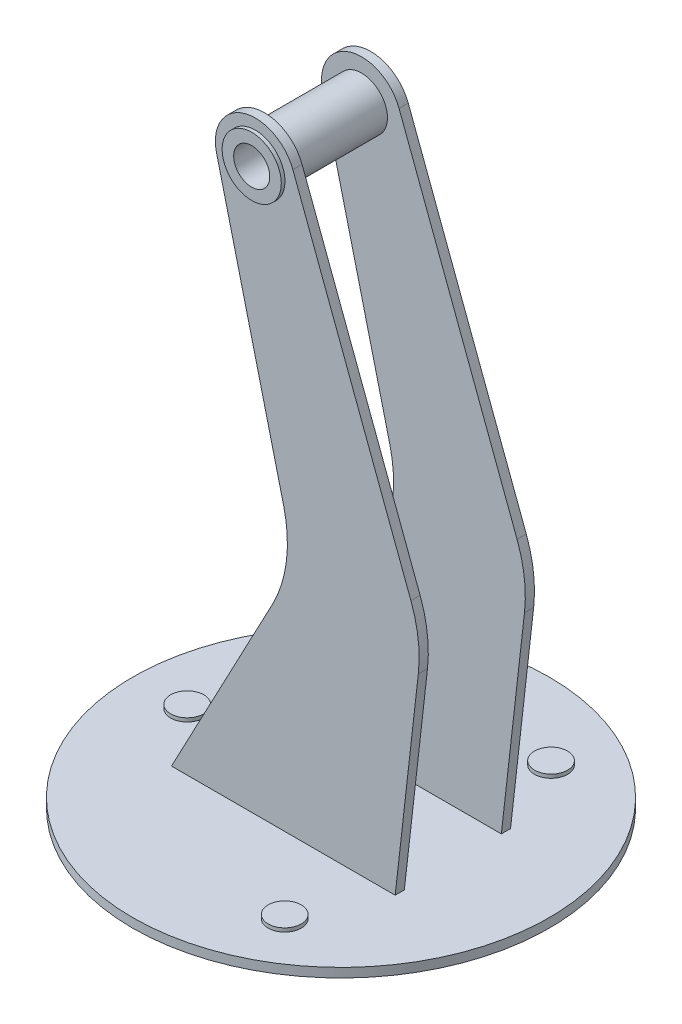
ISO-10303-21;
HEADER;
FILE_DESCRIPTION(('STEP AP214'),'2;1');
FILE_NAME('part.step','',(''),(''),'','','');
FILE_SCHEMA(('AUTOMOTIVE_DESIGN { 1 0 10303 214 1 1 1 1 }'));
ENDSEC;
DATA;
#1=APPLICATION_CONTEXT('core data for automotive mechanical design processes');
#2=APPLICATION_PROTOCOL_DEFINITION('international standard','automotive_design',2000,#1);
#3=PRODUCT_CONTEXT('',#1,'mechanical');
#4=PRODUCT('Part','Part','',(#3));
#5=PRODUCT_RELATED_PRODUCT_CATEGORY('part','',(#4));
#6=PRODUCT_DEFINITION_FORMATION('','',#4);
#7=PRODUCT_DEFINITION_CONTEXT('part definition',#1,'design');
#8=PRODUCT_DEFINITION('design','',#6,#7);
#9=PRODUCT_DEFINITION_SHAPE('','',#8);
#10=(LENGTH_UNIT() NAMED_UNIT(*) SI_UNIT(.MILLI.,.METRE.));
#11=(NAMED_UNIT(*) PLANE_ANGLE_UNIT() SI_UNIT($,.RADIAN.));
#12=(NAMED_UNIT(*) SI_UNIT($,.STERADIAN.) SOLID_ANGLE_UNIT());
#13=UNCERTAINTY_MEASURE_WITH_UNIT(LENGTH_MEASURE(1.E-05),#10,'distance_accuracy_value','');
#14=(GEOMETRIC_REPRESENTATION_CONTEXT(3) GLOBAL_UNCERTAINTY_ASSIGNED_CONTEXT((#13)) GLOBAL_UNIT_ASSIGNED_CONTEXT((#10,
#11,#12)) REPRESENTATION_CONTEXT('',''));
#15=CARTESIAN_POINT('',(0.,0.,0.));
#16=DIRECTION('',(0.,0.,1.));
#17=DIRECTION('',(1.,0.,0.));
#18=AXIS2_PLACEMENT_3D('',#15,#16,#17);
#19=CARTESIAN_POINT('',(59.2200227638363,101.639822494205,0.));
#20=DIRECTION('',(0.,0.,1.));
#21=DIRECTION('',(1.,0.,0.));
#22=AXIS2_PLACEMENT_3D('',#19,#20,#21);
#23=PLANE('',#22);
#24=DIRECTION('',(-0.351683066962373,0.936119127254613,0.));
#25=VECTOR('',#24,1.);
#26=CARTESIAN_POINT('',(149.768395279453,-77.4534922948731,0.));
#27=LINE('',#26,#25);
#28=CARTESIAN_POINT('',(143.838193737558,-61.6683277153218,0.));
#29=VERTEX_POINT('',#28);
#30=CARTESIAN_POINT('',(79.6086760457793,109.299471686989,0.));
#31=VERTEX_POINT('',#30);
#32=EDGE_CURVE('E207',#29,#31,#27,.T.);
#33=ORIENTED_EDGE('',*,*,#32,.F.);
#34=CARTESIAN_POINT('',(78.309854829735,-86.2861424026879,0.));
#35=DIRECTION('',(0.,0.,1.));
#36=DIRECTION('',(1.,0.,0.));
#37=AXIS2_PLACEMENT_3D('',#34,#35,#36);
#38=CIRCLE('',#37,70.);
#39=CARTESIAN_POINT('',(147.860208774999,-94.207522717289,0.));
#40=VERTEX_POINT('',#39);
#41=EDGE_CURVE('E254',#29,#40,#38,.F.);
#42=ORIENTED_EDGE('',*,*,#41,.T.);
#43=DIRECTION('',(0.113162575922872,0.993576484932338,0.));
#44=VECTOR('',#43,1.);
#45=CARTESIAN_POINT('',(135.270890904909,-204.742742466833,0.));
#46=LINE('',#45,#44);
#47=CARTESIAN_POINT('',(135.270890904909,-204.742742466833,0.));
#48=VERTEX_POINT('',#47);
#49=EDGE_CURVE('E204',#48,#40,#46,.T.);
#50=ORIENTED_EDGE('',*,*,#49,.F.);
#51=DIRECTION('',(1.,0.,0.));
#52=VECTOR('',#51,1.);
#53=CARTESIAN_POINT('',(13.5588334424044,-204.742742466833,0.));
#54=LINE('',#53,#52);
#55=CARTESIAN_POINT('',(13.5588334424044,-204.742742466833,0.));
#56=VERTEX_POINT('',#55);
#57=EDGE_CURVE('E184',#56,#48,#54,.T.);
#58=ORIENTED_EDGE('',*,*,#57,.F.);
#59=DIRECTION('',(-0.46817366437276,-0.883636475021138,0.));
#60=VECTOR('',#59,1.);
#61=CARTESIAN_POINT('',(13.5588334424044,-204.742742466833,0.));
#62=LINE('',#61,#60);
#63=CARTESIAN_POINT('',(68.4921371443526,-101.060979611828,0.));
#64=VERTEX_POINT('',#63);
#65=EDGE_CURVE('E189',#64,#56,#62,.T.);
#66=ORIENTED_EDGE('',*,*,#65,.F.);
#67=CARTESIAN_POINT('',(6.63758389287289,-68.2888231057347,0.));
#68=DIRECTION('',(0.,0.,1.));
#69=DIRECTION('',(1.,0.,0.));
#70=AXIS2_PLACEMENT_3D('',#67,#68,#69);
#71=CIRCLE('',#70,70.);
#72=CARTESIAN_POINT('',(74.5982821099149,-51.5155259387451,0.));
#73=VERTEX_POINT('',#72);
#74=EDGE_CURVE('E247',#64,#73,#71,.T.);
#75=ORIENTED_EDGE('',*,*,#74,.T.);
#76=DIRECTION('',(0.239618530956994,-0.970867117386315,0.));
#77=VECTOR('',#76,1.);
#78=CARTESIAN_POINT('',(81.,-77.4534922948731,0.));
#79=LINE('',#78,#77);
#80=CARTESIAN_POINT('',(38.2541588282178,95.7406735860193,0.));
#81=VERTEX_POINT('',#80);
#82=EDGE_CURVE('E211',#81,#73,#79,.T.);
#83=ORIENTED_EDGE('',*,*,#82,.F.);
#84=CARTESIAN_POINT('',(59.2200227638363,101.639822494205,0.));
#85=DIRECTION('',(0.,0.,1.));
#86=DIRECTION('',(1.,0.,0.));
#87=AXIS2_PLACEMENT_3D('',#84,#85,#86);
#88=CIRCLE('',#87,21.7799772361638);
#89=EDGE_CURVE('E209',#31,#81,#88,.T.);
#90=ORIENTED_EDGE('',*,*,#89,.F.);
#91=EDGE_LOOP('',(#33,#42,#50,#58,#66,#75,#83,#90));
#92=FACE_BOUND('',#91,.T.);
#93=CARTESIAN_POINT('',(59.2200227638363,101.639822494205,0.));
#94=DIRECTION('',(0.,0.,1.));
#95=DIRECTION('',(1.,0.,0.));
#96=AXIS2_PLACEMENT_3D('',#93,#94,#95);
#97=CIRCLE('',#96,16.0901380161359);
#98=CARTESIAN_POINT('',(75.3101607799722,101.639822494205,0.));
#99=VERTEX_POINT('',#98);
#100=EDGE_CURVE('E230',#99,#99,#97,.F.);
#101=ORIENTED_EDGE('',*,*,#100,.F.);
#102=EDGE_LOOP('',(#101));
#103=FACE_BOUND('',#102,.T.);
#104=ADVANCED_FACE('F32',(#92,#103),#23,.F.);
#105=CARTESIAN_POINT('',(59.2200227638363,101.639822494205,62.766798880928));
#106=DIRECTION('',(0.,0.,-1.));
#107=DIRECTION('',(0.,1.,0.));
#108=AXIS2_PLACEMENT_3D('',#105,#106,#107);
#109=PLANE('',#108);
#110=DIRECTION('',(-0.113162575922872,-0.993576484932338,0.));
#111=VECTOR('',#110,1.);
#112=CARTESIAN_POINT('',(149.768395279453,-77.4534922948731,62.7667988809279));
#113=LINE('',#112,#111);
#114=CARTESIAN_POINT('',(147.860208774999,-94.2075227172889,62.7667988809279));
#115=VERTEX_POINT('',#114);
#116=CARTESIAN_POINT('',(135.270890904909,-204.742742466833,62.7667988809279));
#117=VERTEX_POINT('',#116);
#118=EDGE_CURVE('E171',#115,#117,#113,.T.);
#119=ORIENTED_EDGE('',*,*,#118,.F.);
#120=CARTESIAN_POINT('',(78.309854829735,-86.2861424026879,62.7667988809279));
#121=DIRECTION('',(0.,0.,-1.));
#122=DIRECTION('',(0.,1.,0.));
#123=AXIS2_PLACEMENT_3D('',#120,#121,#122);
#124=CIRCLE('',#123,70.);
#125=CARTESIAN_POINT('',(143.838193737558,-61.6683277153217,62.7667988809279));
#126=VERTEX_POINT('',#125);
#127=EDGE_CURVE('E55',#115,#126,#124,.F.);
#128=ORIENTED_EDGE('',*,*,#127,.T.);
#129=DIRECTION('',(0.351683066962373,-0.936119127254613,0.));
#130=VECTOR('',#129,1.);
#131=CARTESIAN_POINT('',(79.6086760457792,109.299471686989,62.766798880928));
#132=LINE('',#131,#130);
#133=CARTESIAN_POINT('',(79.6086760457793,109.299471686989,62.766798880928));
#134=VERTEX_POINT('',#133);
#135=EDGE_CURVE('E168',#134,#126,#132,.T.);
#136=ORIENTED_EDGE('',*,*,#135,.F.);
#137=CARTESIAN_POINT('',(59.2200227638363,101.639822494205,62.766798880928));
#138=DIRECTION('',(0.,0.,-1.));
#139=DIRECTION('',(0.,1.,0.));
#140=AXIS2_PLACEMENT_3D('',#137,#138,#139);
#141=CIRCLE('',#140,21.7799772361638);
#142=CARTESIAN_POINT('',(38.2541588282178,95.7406735860193,62.766798880928));
#143=VERTEX_POINT('',#142);
#144=EDGE_CURVE('E320',#143,#134,#141,.T.);
#145=ORIENTED_EDGE('',*,*,#144,.F.);
#146=DIRECTION('',(-0.239618530956994,0.970867117386315,0.));
#147=VECTOR('',#146,1.);
#148=CARTESIAN_POINT('',(81.,-77.4534922948731,62.7667988809279));
#149=LINE('',#148,#147);
#150=CARTESIAN_POINT('',(74.5982821099149,-51.5155259387451,62.7667988809279));
#151=VERTEX_POINT('',#150);
#152=EDGE_CURVE('E318',#151,#143,#149,.T.);
#153=ORIENTED_EDGE('',*,*,#152,.F.);
#154=CARTESIAN_POINT('',(6.63758389287289,-68.2888231057347,62.7667988809279));
#155=DIRECTION('',(0.,0.,-1.));
#156=DIRECTION('',(0.,1.,0.));
#157=AXIS2_PLACEMENT_3D('',#154,#155,#156);
#158=CIRCLE('',#157,70.);
#159=CARTESIAN_POINT('',(68.4921371443526,-101.060979611828,62.7667988809279));
#160=VERTEX_POINT('',#159);
#161=EDGE_CURVE('E243',#151,#160,#158,.T.);
#162=ORIENTED_EDGE('',*,*,#161,.T.);
#163=DIRECTION('',(0.46817366437276,0.883636475021138,0.));
#164=VECTOR('',#163,1.);
#165=CARTESIAN_POINT('',(13.5588334424044,-204.742742466833,62.7667988809279));
#166=LINE('',#165,#164);
#167=CARTESIAN_POINT('',(13.5588334424044,-204.742742466833,62.7667988809279));
#168=VERTEX_POINT('',#167);
#169=EDGE_CURVE('E315',#168,#160,#166,.T.);
#170=ORIENTED_EDGE('',*,*,#169,.F.);
#171=DIRECTION('',(-1.,0.,0.));
#172=VECTOR('',#171,1.);
#173=CARTESIAN_POINT('',(135.270890904909,-204.742742466833,62.7667988809279));
#174=LINE('',#173,#172);
#175=EDGE_CURVE('E313',#117,#168,#174,.T.);
#176=ORIENTED_EDGE('',*,*,#175,.F.);
#177=EDGE_LOOP('',(#119,#128,#136,#145,#153,#162,#170,#176));
#178=FACE_BOUND('',#177,.T.);
#179=CARTESIAN_POINT('',(59.2200227638363,101.639822494205,62.766798880928));
#180=DIRECTION('',(0.,0.,-1.));
#181=DIRECTION('',(0.,1.,0.));
#182=AXIS2_PLACEMENT_3D('',#179,#180,#181);
#183=CIRCLE('',#182,16.0901380161359);
#184=CARTESIAN_POINT('',(59.2200227638363,117.729960510341,62.766798880928));
#185=VERTEX_POINT('',#184);
#186=EDGE_CURVE('E227',#185,#185,#183,.F.);
#187=ORIENTED_EDGE('',*,*,#186,.F.);
#188=EDGE_LOOP('',(#187));
#189=FACE_BOUND('',#188,.T.);
#190=ADVANCED_FACE('F334',(#178,#189),#109,.F.);
#191=CARTESIAN_POINT('',(59.2200227638363,101.639822494205,5.));
#192=DIRECTION('',(0.,0.,1.));
#193=DIRECTION('',(1.,0.,0.));
#194=AXIS2_PLACEMENT_3D('',#191,#192,#193);
#195=PLANE('',#194);
#196=DIRECTION('',(0.113162575922872,0.993576484932338,0.));
#197=VECTOR('',#196,1.);
#198=CARTESIAN_POINT('',(135.270890904909,-204.742742466833,5.));
#199=LINE('',#198,#197);
#200=CARTESIAN_POINT('',(135.270890904909,-204.742742466833,5.));
#201=VERTEX_POINT('',#200);
#202=CARTESIAN_POINT('',(147.860208774999,-94.207522717289,5.));
#203=VERTEX_POINT('',#202);
#204=EDGE_CURVE('E188',#201,#203,#199,.T.);
#205=ORIENTED_EDGE('',*,*,#204,.T.);
#206=CARTESIAN_POINT('',(78.309854829735,-86.2861424026879,5.));
#207=DIRECTION('',(0.,0.,1.));
#208=DIRECTION('',(1.,0.,0.));
#209=AXIS2_PLACEMENT_3D('',#206,#207,#208);
#210=CIRCLE('',#209,70.);
#211=CARTESIAN_POINT('',(143.838193737558,-61.6683277153218,5.));
#212=VERTEX_POINT('',#211);
#213=EDGE_CURVE('E258',#203,#212,#210,.T.);
#214=ORIENTED_EDGE('',*,*,#213,.T.);
#215=DIRECTION('',(-0.351683066962373,0.936119127254613,0.));
#216=VECTOR('',#215,1.);
#217=CARTESIAN_POINT('',(149.768395279453,-77.4534922948731,5.));
#218=LINE('',#217,#216);
#219=CARTESIAN_POINT('',(79.6086760457793,109.299471686989,5.));
#220=VERTEX_POINT('',#219);
#221=EDGE_CURVE('E192',#212,#220,#218,.T.);
#222=ORIENTED_EDGE('',*,*,#221,.T.);
#223=CARTESIAN_POINT('',(59.2200227638363,101.639822494205,5.));
#224=DIRECTION('',(0.,0.,1.));
#225=DIRECTION('',(1.,0.,0.));
#226=AXIS2_PLACEMENT_3D('',#223,#224,#225);
#227=CIRCLE('',#226,21.7799772361638);
#228=CARTESIAN_POINT('',(38.2541588282178,95.7406735860193,5.));
#229=VERTEX_POINT('',#228);
#230=EDGE_CURVE('E194',#220,#229,#227,.T.);
#231=ORIENTED_EDGE('',*,*,#230,.T.);
#232=DIRECTION('',(0.239618530956994,-0.970867117386315,0.));
#233=VECTOR('',#232,1.);
#234=CARTESIAN_POINT('',(81.,-77.4534922948731,5.));
#235=LINE('',#234,#233);
#236=CARTESIAN_POINT('',(74.5982821099149,-51.5155259387451,5.));
#237=VERTEX_POINT('',#236);
#238=EDGE_CURVE('E196',#229,#237,#235,.T.);
#239=ORIENTED_EDGE('',*,*,#238,.T.);
#240=CARTESIAN_POINT('',(6.63758389287289,-68.2888231057347,5.));
#241=DIRECTION('',(0.,0.,1.));
#242=DIRECTION('',(1.,0.,0.));
#243=AXIS2_PLACEMENT_3D('',#240,#241,#242);
#244=CIRCLE('',#243,70.);
#245=CARTESIAN_POINT('',(68.4921371443526,-101.060979611828,5.));
#246=VERTEX_POINT('',#245);
#247=EDGE_CURVE('E249',#237,#246,#244,.F.);
#248=ORIENTED_EDGE('',*,*,#247,.T.);
#249=DIRECTION('',(-0.46817366437276,-0.883636475021138,0.));
#250=VECTOR('',#249,1.);
#251=CARTESIAN_POINT('',(13.5588334424044,-204.742742466833,5.));
#252=LINE('',#251,#250);
#253=CARTESIAN_POINT('',(13.5588334424044,-204.742742466833,5.));
#254=VERTEX_POINT('',#253);
#255=EDGE_CURVE('E199',#246,#254,#252,.T.);
#256=ORIENTED_EDGE('',*,*,#255,.T.);
#257=DIRECTION('',(1.,0.,0.));
#258=VECTOR('',#257,1.);
#259=CARTESIAN_POINT('',(13.5588334424044,-204.742742466833,5.));
#260=LINE('',#259,#258);
#261=EDGE_CURVE('E185',#254,#201,#260,.T.);
#262=ORIENTED_EDGE('',*,*,#261,.T.);
#263=EDGE_LOOP('',(#205,#214,#222,#231,#239,#248,#256,#262));
#264=FACE_BOUND('',#263,.T.);
#265=CARTESIAN_POINT('',(59.2200227638363,101.639822494205,5.));
#266=DIRECTION('',(0.,0.,1.));
#267=DIRECTION('',(1.,0.,0.));
#268=AXIS2_PLACEMENT_3D('',#265,#266,#267);
#269=CIRCLE('',#268,14.0768017661452);
#270=CARTESIAN_POINT('',(73.2968245299815,101.639822494205,5.));
#271=VERTEX_POINT('',#270);
#272=EDGE_CURVE('E176',#271,#271,#269,.T.);
#273=ORIENTED_EDGE('',*,*,#272,.F.);
#274=EDGE_LOOP('',(#273));
#275=FACE_BOUND('',#274,.T.);
#276=ADVANCED_FACE('F361',(#264,#275),#195,.T.);
#277=CARTESIAN_POINT('',(135.270890904909,-204.742742466833,5.));
#278=DIRECTION('',(-0.993576484932338,0.113162575922872,0.));
#279=DIRECTION('',(-0.113162575922872,-0.993576484932338,0.));
#280=AXIS2_PLACEMENT_3D('',#277,#278,#279);
#281=PLANE('',#280);
#282=ORIENTED_EDGE('',*,*,#49,.T.);
#283=DIRECTION('',(0.,0.,-1.));
#284=VECTOR('',#283,1.);
#285=CARTESIAN_POINT('',(147.860208774999,-94.207522717289,5.));
#286=LINE('',#285,#284);
#287=EDGE_CURVE('E256',#40,#203,#286,.F.);
#288=ORIENTED_EDGE('',*,*,#287,.T.);
#289=ORIENTED_EDGE('',*,*,#204,.F.);
#290=DIRECTION('',(0.,0.,-1.));
#291=VECTOR('',#290,1.);
#292=CARTESIAN_POINT('',(135.270890904909,-204.742742466833,5.));
#293=LINE('',#292,#291);
#294=EDGE_CURVE('E224',#201,#48,#293,.T.);
#295=ORIENTED_EDGE('',*,*,#294,.T.);
#296=EDGE_LOOP('',(#282,#288,#289,#295));
#297=FACE_BOUND('',#296,.T.);
#298=ADVANCED_FACE('F384',(#297),#281,.F.);
#299=CARTESIAN_POINT('',(149.768395279453,-77.4534922948731,5.));
#300=DIRECTION('',(-0.936119127254613,-0.351683066962373,0.));
#301=DIRECTION('',(0.351683066962373,-0.936119127254613,0.));
#302=AXIS2_PLACEMENT_3D('',#299,#300,#301);
#303=PLANE('',#302);
#304=ORIENTED_EDGE('',*,*,#221,.F.);
#305=DIRECTION('',(0.,0.,-1.));
#306=VECTOR('',#305,1.);
#307=CARTESIAN_POINT('',(143.838193737558,-61.6683277153218,5.));
#308=LINE('',#307,#306);
#309=EDGE_CURVE('E251',#212,#29,#308,.T.);
#310=ORIENTED_EDGE('',*,*,#309,.T.);
#311=ORIENTED_EDGE('',*,*,#32,.T.);
#312=DIRECTION('',(0.,0.,-1.));
#313=VECTOR('',#312,1.);
#314=CARTESIAN_POINT('',(79.6086760457793,109.299471686989,5.));
#315=LINE('',#314,#313);
#316=EDGE_CURVE('E221',#220,#31,#315,.T.);
#317=ORIENTED_EDGE('',*,*,#316,.F.);
#318=EDGE_LOOP('',(#304,#310,#311,#317));
#319=FACE_BOUND('',#318,.T.);
#320=ADVANCED_FACE('F380',(#319),#303,.F.);
#321=CARTESIAN_POINT('',(59.2200227638363,101.639822494205,5.));
#322=DIRECTION('',(0.,0.,-1.));
#323=DIRECTION('',(-1.,0.,0.));
#324=AXIS2_PLACEMENT_3D('',#321,#322,#323);
#325=CYLINDRICAL_SURFACE('',#324,21.7799772361638);
#326=ORIENTED_EDGE('',*,*,#89,.T.);
#327=DIRECTION('',(0.,0.,-1.));
#328=VECTOR('',#327,1.);
#329=CARTESIAN_POINT('',(38.2541588282178,95.7406735860193,5.));
#330=LINE('',#329,#328);
#331=EDGE_CURVE('E218',#229,#81,#330,.T.);
#332=ORIENTED_EDGE('',*,*,#331,.F.);
#333=ORIENTED_EDGE('',*,*,#230,.F.);
#334=ORIENTED_EDGE('',*,*,#316,.T.);
#335=EDGE_LOOP('',(#326,#332,#333,#334));
#336=FACE_BOUND('',#335,.T.);
#337=ADVANCED_FACE('F376',(#336),#325,.T.);
#338=CARTESIAN_POINT('',(81.,-77.4534922948731,5.));
#339=DIRECTION('',(0.970867117386315,0.239618530956994,0.));
#340=DIRECTION('',(-0.239618530956994,0.970867117386315,0.));
#341=AXIS2_PLACEMENT_3D('',#338,#339,#340);
#342=PLANE('',#341);
#343=ORIENTED_EDGE('',*,*,#82,.T.);
#344=DIRECTION('',(0.,0.,-1.));
#345=VECTOR('',#344,1.);
#346=CARTESIAN_POINT('',(74.5982821099149,-51.5155259387451,5.));
#347=LINE('',#346,#345);
#348=EDGE_CURVE('E241',#73,#237,#347,.F.);
#349=ORIENTED_EDGE('',*,*,#348,.T.);
#350=ORIENTED_EDGE('',*,*,#238,.F.);
#351=ORIENTED_EDGE('',*,*,#331,.T.);
#352=EDGE_LOOP('',(#343,#349,#350,#351));
#353=FACE_BOUND('',#352,.T.);
#354=ADVANCED_FACE('F372',(#353),#342,.F.);
#355=CARTESIAN_POINT('',(13.5588334424044,-204.742742466833,5.));
#356=DIRECTION('',(0.883636475021138,-0.46817366437276,0.));
#357=DIRECTION('',(0.46817366437276,0.883636475021138,0.));
#358=AXIS2_PLACEMENT_3D('',#355,#356,#357);
#359=PLANE('',#358);
#360=ORIENTED_EDGE('',*,*,#255,.F.);
#361=DIRECTION('',(0.,0.,-1.));
#362=VECTOR('',#361,1.);
#363=CARTESIAN_POINT('',(68.4921371443526,-101.060979611828,0.));
#364=LINE('',#363,#362);
#365=EDGE_CURVE('E238',#246,#64,#364,.T.);
#366=ORIENTED_EDGE('',*,*,#365,.T.);
#367=ORIENTED_EDGE('',*,*,#65,.T.);
#368=DIRECTION('',(0.,0.,-1.));
#369=VECTOR('',#368,1.);
#370=CARTESIAN_POINT('',(13.5588334424044,-204.742742466833,5.));
#371=LINE('',#370,#369);
#372=EDGE_CURVE('E201',#254,#56,#371,.T.);
#373=ORIENTED_EDGE('',*,*,#372,.F.);
#374=EDGE_LOOP('',(#360,#366,#367,#373));
#375=FACE_BOUND('',#374,.T.);
#376=ADVANCED_FACE('F368',(#375),#359,.F.);
#377=CARTESIAN_POINT('',(59.2200227638363,101.639822494205,5.));
#378=DIRECTION('',(0.,0.,-1.));
#379=DIRECTION('',(-1.,0.,0.));
#380=AXIS2_PLACEMENT_3D('',#377,#378,#379);
#381=CYLINDRICAL_SURFACE('',#380,9.81013134883745);
#382=CARTESIAN_POINT('',(59.2200227638363,101.639822494205,64.7667988809279));
#383=DIRECTION('',(0.,0.,1.));
#384=DIRECTION('',(1.,0.,0.));
#385=AXIS2_PLACEMENT_3D('',#382,#383,#384);
#386=CIRCLE('',#385,9.81013134883745);
#387=CARTESIAN_POINT('',(69.0301541126737,101.639822494205,64.7667988809279));
#388=VERTEX_POINT('',#387);
#389=EDGE_CURVE('E298',#388,#388,#386,.T.);
#390=ORIENTED_EDGE('',*,*,#389,.T.);
#391=EDGE_LOOP('',(#390));
#392=FACE_BOUND('',#391,.T.);
#393=CARTESIAN_POINT('',(59.2200227638363,101.639822494205,-2.));
#394=DIRECTION('',(0.,0.,-1.));
#395=DIRECTION('',(-1.,0.,0.));
#396=AXIS2_PLACEMENT_3D('',#393,#394,#395);
#397=CIRCLE('',#396,9.81013134883745);
#398=CARTESIAN_POINT('',(49.4098914149988,101.639822494205,-2.));
#399=VERTEX_POINT('',#398);
#400=EDGE_CURVE('E287',#399,#399,#397,.T.);
#401=ORIENTED_EDGE('',*,*,#400,.T.);
#402=EDGE_LOOP('',(#401));
#403=FACE_BOUND('',#402,.T.);
#404=ADVANCED_FACE('F371',(#392,#403),#381,.F.);
#405=CARTESIAN_POINT('',(59.2200227638363,101.639822494205,97.5820068259682));
#406=DIRECTION('',(0.,0.,-1.));
#407=DIRECTION('',(-1.,0.,0.));
#408=AXIS2_PLACEMENT_3D('',#405,#406,#407);
#409=CYLINDRICAL_SURFACE('',#408,14.0768017661452);
#410=CARTESIAN_POINT('',(59.2200227638363,101.639822494205,57.766798880928));
#411=DIRECTION('',(0.,0.,-1.));
#412=DIRECTION('',(0.,1.,0.));
#413=AXIS2_PLACEMENT_3D('',#410,#411,#412);
#414=CIRCLE('',#413,14.0768017661452);
#415=CARTESIAN_POINT('',(59.2200227638363,115.71662426035,57.766798880928));
#416=VERTEX_POINT('',#415);
#417=EDGE_CURVE('E173',#416,#416,#414,.T.);
#418=ORIENTED_EDGE('',*,*,#417,.T.);
#419=EDGE_LOOP('',(#418));
#420=FACE_BOUND('',#419,.T.);
#421=ORIENTED_EDGE('',*,*,#272,.T.);
#422=EDGE_LOOP('',(#421));
#423=FACE_BOUND('',#422,.T.);
#424=ADVANCED_FACE('F424',(#420,#423),#409,.T.);
#425=CARTESIAN_POINT('',(149.768395279453,-77.4534922948731,57.7667988809279));
#426=DIRECTION('',(-0.993576484932338,0.113162575922872,0.));
#427=DIRECTION('',(-0.113162575922872,-0.993576484932338,0.));
#428=AXIS2_PLACEMENT_3D('',#425,#426,#427);
#429=PLANE('',#428);
#430=DIRECTION('',(-0.113162575922872,-0.993576484932338,0.));
#431=VECTOR('',#430,1.);
#432=CARTESIAN_POINT('',(149.768395279453,-77.4534922948731,57.7667988809279));
#433=LINE('',#432,#431);
#434=CARTESIAN_POINT('',(147.860208774999,-94.2075227172889,57.7667988809279));
#435=VERTEX_POINT('',#434);
#436=CARTESIAN_POINT('',(135.270890904909,-204.742742466833,57.7667988809279));
#437=VERTEX_POINT('',#436);
#438=EDGE_CURVE('E159',#435,#437,#433,.T.);
#439=ORIENTED_EDGE('',*,*,#438,.F.);
#440=DIRECTION('',(0.,0.,1.));
#441=VECTOR('',#440,1.);
#442=CARTESIAN_POINT('',(147.860208774999,-94.2075227172889,57.7667988809279));
#443=LINE('',#442,#441);
#444=EDGE_CURVE('E260',#435,#115,#443,.T.);
#445=ORIENTED_EDGE('',*,*,#444,.T.);
#446=ORIENTED_EDGE('',*,*,#118,.T.);
#447=DIRECTION('',(0.,0.,1.));
#448=VECTOR('',#447,1.);
#449=CARTESIAN_POINT('',(135.270890904909,-204.742742466833,57.7667988809279));
#450=LINE('',#449,#448);
#451=EDGE_CURVE('E151',#437,#117,#450,.T.);
#452=ORIENTED_EDGE('',*,*,#451,.F.);
#453=EDGE_LOOP('',(#439,#445,#446,#452));
#454=FACE_BOUND('',#453,.T.);
#455=ADVANCED_FACE('F170',(#454),#429,.F.);
#456=CARTESIAN_POINT('',(13.5588334424044,-204.742742466833,57.7667988809279));
#457=DIRECTION('',(0.883636475021138,-0.46817366437276,0.));
#458=DIRECTION('',(0.46817366437276,0.883636475021138,0.));
#459=AXIS2_PLACEMENT_3D('',#456,#457,#458);
#460=PLANE('',#459);
#461=ORIENTED_EDGE('',*,*,#169,.T.);
#462=DIRECTION('',(0.,0.,1.));
#463=VECTOR('',#462,1.);
#464=CARTESIAN_POINT('',(68.4921371443526,-101.060979611828,57.7667988809279));
#465=LINE('',#464,#463);
#466=CARTESIAN_POINT('',(68.4921371443526,-101.060979611828,57.7667988809279));
#467=VERTEX_POINT('',#466);
#468=EDGE_CURVE('E236',#160,#467,#465,.F.);
#469=ORIENTED_EDGE('',*,*,#468,.T.);
#470=DIRECTION('',(0.46817366437276,0.883636475021138,0.));
#471=VECTOR('',#470,1.);
#472=CARTESIAN_POINT('',(13.5588334424044,-204.742742466833,57.7667988809279));
#473=LINE('',#472,#471);
#474=CARTESIAN_POINT('',(13.5588334424044,-204.742742466833,57.7667988809279));
#475=VERTEX_POINT('',#474);
#476=EDGE_CURVE('E158',#475,#467,#473,.T.);
#477=ORIENTED_EDGE('',*,*,#476,.F.);
#478=DIRECTION('',(0.,0.,1.));
#479=VECTOR('',#478,1.);
#480=CARTESIAN_POINT('',(13.5588334424044,-204.742742466833,57.7667988809279));
#481=LINE('',#480,#479);
#482=EDGE_CURVE('E154',#475,#168,#481,.T.);
#483=ORIENTED_EDGE('',*,*,#482,.T.);
#484=EDGE_LOOP('',(#461,#469,#477,#483));
#485=FACE_BOUND('',#484,.T.);
#486=ADVANCED_FACE('F340',(#485),#460,.F.);
#487=CARTESIAN_POINT('',(81.,-77.4534922948731,57.7667988809279));
#488=DIRECTION('',(0.970867117386315,0.239618530956994,0.));
#489=DIRECTION('',(-0.239618530956994,0.970867117386315,0.));
#490=AXIS2_PLACEMENT_3D('',#487,#488,#489);
#491=PLANE('',#490);
#492=DIRECTION('',(-0.239618530956994,0.970867117386315,0.));
#493=VECTOR('',#492,1.);
#494=CARTESIAN_POINT('',(81.,-77.4534922948731,57.7667988809279));
#495=LINE('',#494,#493);
#496=CARTESIAN_POINT('',(74.5982821099149,-51.5155259387451,57.7667988809279));
#497=VERTEX_POINT('',#496);
#498=CARTESIAN_POINT('',(38.2541588282178,95.7406735860193,57.766798880928));
#499=VERTEX_POINT('',#498);
#500=EDGE_CURVE('E305',#497,#499,#495,.T.);
#501=ORIENTED_EDGE('',*,*,#500,.F.);
#502=DIRECTION('',(0.,0.,1.));
#503=VECTOR('',#502,1.);
#504=CARTESIAN_POINT('',(74.5982821099149,-51.5155259387451,62.7667988809279));
#505=LINE('',#504,#503);
#506=EDGE_CURVE('E233',#497,#151,#505,.T.);
#507=ORIENTED_EDGE('',*,*,#506,.T.);
#508=ORIENTED_EDGE('',*,*,#152,.T.);
#509=DIRECTION('',(0.,0.,1.));
#510=VECTOR('',#509,1.);
#511=CARTESIAN_POINT('',(38.2541588282178,95.7406735860193,57.766798880928));
#512=LINE('',#511,#510);
#513=EDGE_CURVE('E178',#499,#143,#512,.T.);
#514=ORIENTED_EDGE('',*,*,#513,.F.);
#515=EDGE_LOOP('',(#501,#507,#508,#514));
#516=FACE_BOUND('',#515,.T.);
#517=ADVANCED_FACE('F346',(#516),#491,.F.);
#518=CARTESIAN_POINT('',(59.2200227638363,101.639822494205,57.766798880928));
#519=DIRECTION('',(0.,0.,1.));
#520=DIRECTION('',(0.,-1.,0.));
#521=AXIS2_PLACEMENT_3D('',#518,#519,#520);
#522=CYLINDRICAL_SURFACE('',#521,21.7799772361638);
#523=ORIENTED_EDGE('',*,*,#144,.T.);
#524=DIRECTION('',(0.,0.,1.));
#525=VECTOR('',#524,1.);
#526=CARTESIAN_POINT('',(79.6086760457793,109.299471686989,57.766798880928));
#527=LINE('',#526,#525);
#528=CARTESIAN_POINT('',(79.6086760457793,109.299471686989,57.766798880928));
#529=VERTEX_POINT('',#528);
#530=EDGE_CURVE('E311',#529,#134,#527,.T.);
#531=ORIENTED_EDGE('',*,*,#530,.F.);
#532=CARTESIAN_POINT('',(59.2200227638363,101.639822494205,57.766798880928));
#533=DIRECTION('',(0.,0.,-1.));
#534=DIRECTION('',(0.,1.,0.));
#535=AXIS2_PLACEMENT_3D('',#532,#533,#534);
#536=CIRCLE('',#535,21.7799772361638);
#537=EDGE_CURVE('E307',#499,#529,#536,.T.);
#538=ORIENTED_EDGE('',*,*,#537,.F.);
#539=ORIENTED_EDGE('',*,*,#513,.T.);
#540=EDGE_LOOP('',(#523,#531,#538,#539));
#541=FACE_BOUND('',#540,.T.);
#542=ADVANCED_FACE('F329',(#541),#522,.T.);
#543=CARTESIAN_POINT('',(79.6086760457792,109.299471686989,57.766798880928));
#544=DIRECTION('',(-0.936119127254613,-0.351683066962373,0.));
#545=DIRECTION('',(0.351683066962373,-0.936119127254613,0.));
#546=AXIS2_PLACEMENT_3D('',#543,#544,#545);
#547=PLANE('',#546);
#548=ORIENTED_EDGE('',*,*,#135,.T.);
#549=DIRECTION('',(0.,0.,1.));
#550=VECTOR('',#549,1.);
#551=CARTESIAN_POINT('',(143.838193737558,-61.6683277153218,57.7667988809279));
#552=LINE('',#551,#550);
#553=CARTESIAN_POINT('',(143.838193737558,-61.6683277153217,57.7667988809279));
#554=VERTEX_POINT('',#553);
#555=EDGE_CURVE('E47',#126,#554,#552,.F.);
#556=ORIENTED_EDGE('',*,*,#555,.T.);
#557=DIRECTION('',(0.351683066962373,-0.936119127254613,0.));
#558=VECTOR('',#557,1.);
#559=CARTESIAN_POINT('',(79.6086760457792,109.299471686989,57.766798880928));
#560=LINE('',#559,#558);
#561=EDGE_CURVE('E309',#529,#554,#560,.T.);
#562=ORIENTED_EDGE('',*,*,#561,.F.);
#563=ORIENTED_EDGE('',*,*,#530,.T.);
#564=EDGE_LOOP('',(#548,#556,#562,#563));
#565=FACE_BOUND('',#564,.T.);
#566=ADVANCED_FACE('F336',(#565),#547,.F.);
#567=CARTESIAN_POINT('',(59.2200227638363,101.639822494205,57.766798880928));
#568=DIRECTION('',(0.,0.,-1.));
#569=DIRECTION('',(0.,1.,0.));
#570=AXIS2_PLACEMENT_3D('',#567,#568,#569);
#571=PLANE('',#570);
#572=ORIENTED_EDGE('',*,*,#417,.F.);
#573=EDGE_LOOP('',(#572));
#574=FACE_BOUND('',#573,.T.);
#575=ORIENTED_EDGE('',*,*,#561,.T.);
#576=CARTESIAN_POINT('',(78.309854829735,-86.2861424026879,57.7667988809279));
#577=DIRECTION('',(0.,0.,-1.));
#578=DIRECTION('',(0.,1.,0.));
#579=AXIS2_PLACEMENT_3D('',#576,#577,#578);
#580=CIRCLE('',#579,70.);
#581=EDGE_CURVE('E164',#554,#435,#580,.T.);
#582=ORIENTED_EDGE('',*,*,#581,.T.);
#583=ORIENTED_EDGE('',*,*,#438,.T.);
#584=DIRECTION('',(-1.,0.,0.));
#585=VECTOR('',#584,1.);
#586=CARTESIAN_POINT('',(135.270890904909,-204.742742466833,57.7667988809279));
#587=LINE('',#586,#585);
#588=EDGE_CURVE('E146',#437,#475,#587,.T.);
#589=ORIENTED_EDGE('',*,*,#588,.T.);
#590=ORIENTED_EDGE('',*,*,#476,.T.);
#591=CARTESIAN_POINT('',(6.63758389287289,-68.2888231057347,57.7667988809279));
#592=DIRECTION('',(0.,0.,-1.));
#593=DIRECTION('',(0.,1.,0.));
#594=AXIS2_PLACEMENT_3D('',#591,#592,#593);
#595=CIRCLE('',#594,70.);
#596=EDGE_CURVE('E245',#467,#497,#595,.F.);
#597=ORIENTED_EDGE('',*,*,#596,.T.);
#598=ORIENTED_EDGE('',*,*,#500,.T.);
#599=ORIENTED_EDGE('',*,*,#537,.T.);
#600=EDGE_LOOP('',(#575,#582,#583,#589,#590,#597,#598,#599));
#601=FACE_BOUND('',#600,.T.);
#602=ADVANCED_FACE('F162',(#574,#601),#571,.T.);
#603=CARTESIAN_POINT('',(59.2200227638363,101.639822494205,64.7667988809279));
#604=DIRECTION('',(0.,0.,1.));
#605=DIRECTION('',(1.,0.,0.));
#606=AXIS2_PLACEMENT_3D('',#603,#604,#605);
#607=PLANE('',#606);
#608=CARTESIAN_POINT('',(59.2200227638363,101.639822494205,64.7667988809279));
#609=DIRECTION('',(0.,0.,1.));
#610=DIRECTION('',(1.,0.,0.));
#611=AXIS2_PLACEMENT_3D('',#608,#609,#610);
#612=CIRCLE('',#611,16.0901380161359);
#613=CARTESIAN_POINT('',(75.3101607799722,101.639822494205,64.7667988809279));
#614=VERTEX_POINT('',#613);
#615=EDGE_CURVE('E301',#614,#614,#612,.T.);
#616=ORIENTED_EDGE('',*,*,#615,.T.);
#617=EDGE_LOOP('',(#616));
#618=FACE_BOUND('',#617,.T.);
#619=ORIENTED_EDGE('',*,*,#389,.F.);
#620=EDGE_LOOP('',(#619));
#621=FACE_BOUND('',#620,.T.);
#622=ADVANCED_FACE('F437',(#618,#621),#607,.T.);
#623=CARTESIAN_POINT('',(59.2200227638363,101.639822494205,64.7667988809279));
#624=DIRECTION('',(0.,0.,-1.));
#625=DIRECTION('',(-1.,0.,0.));
#626=AXIS2_PLACEMENT_3D('',#623,#624,#625);
#627=CYLINDRICAL_SURFACE('',#626,16.0901380161359);
#628=ORIENTED_EDGE('',*,*,#615,.F.);
#629=EDGE_LOOP('',(#628));
#630=FACE_BOUND('',#629,.T.);
#631=ORIENTED_EDGE('',*,*,#186,.T.);
#632=EDGE_LOOP('',(#631));
#633=FACE_BOUND('',#632,.T.);
#634=ADVANCED_FACE('F443',(#630,#633),#627,.T.);
#635=CARTESIAN_POINT('',(59.2200227638363,101.639822494205,-2.));
#636=DIRECTION('',(0.,0.,-1.));
#637=DIRECTION('',(-1.,0.,0.));
#638=AXIS2_PLACEMENT_3D('',#635,#636,#637);
#639=PLANE('',#638);
#640=CARTESIAN_POINT('',(59.2200227638363,101.639822494205,-2.));
#641=DIRECTION('',(0.,0.,-1.));
#642=DIRECTION('',(-1.,0.,0.));
#643=AXIS2_PLACEMENT_3D('',#640,#641,#642);
#644=CIRCLE('',#643,16.0901380161359);
#645=CARTESIAN_POINT('',(43.1298847477004,101.639822494205,-2.));
#646=VERTEX_POINT('',#645);
#647=EDGE_CURVE('E295',#646,#646,#644,.T.);
#648=ORIENTED_EDGE('',*,*,#647,.T.);
#649=EDGE_LOOP('',(#648));
#650=FACE_BOUND('',#649,.T.);
#651=ORIENTED_EDGE('',*,*,#400,.F.);
#652=EDGE_LOOP('',(#651));
#653=FACE_BOUND('',#652,.T.);
#654=ADVANCED_FACE('F449',(#650,#653),#639,.T.);
#655=CARTESIAN_POINT('',(59.2200227638363,101.639822494205,-2.));
#656=DIRECTION('',(0.,0.,1.));
#657=DIRECTION('',(1.,0.,0.));
#658=AXIS2_PLACEMENT_3D('',#655,#656,#657);
#659=CYLINDRICAL_SURFACE('',#658,16.0901380161359);
#660=ORIENTED_EDGE('',*,*,#647,.F.);
#661=EDGE_LOOP('',(#660));
#662=FACE_BOUND('',#661,.T.);
#663=ORIENTED_EDGE('',*,*,#100,.T.);
#664=EDGE_LOOP('',(#663));
#665=FACE_BOUND('',#664,.T.);
#666=ADVANCED_FACE('F392',(#662,#665),#659,.T.);
#667=CARTESIAN_POINT('',(6.63758389287289,-68.2888231057347,57.7667988809279));
#668=DIRECTION('',(0.,0.,-1.));
#669=DIRECTION('',(0.,1.,0.));
#670=AXIS2_PLACEMENT_3D('',#667,#668,#669);
#671=CYLINDRICAL_SURFACE('',#670,70.);
#672=ORIENTED_EDGE('',*,*,#596,.F.);
#673=ORIENTED_EDGE('',*,*,#468,.F.);
#674=ORIENTED_EDGE('',*,*,#161,.F.);
#675=ORIENTED_EDGE('',*,*,#506,.F.);
#676=EDGE_LOOP('',(#672,#673,#674,#675));
#677=FACE_BOUND('',#676,.T.);
#678=ADVANCED_FACE('F345',(#677),#671,.F.);
#679=CARTESIAN_POINT('',(6.63758389287289,-68.2888231057347,5.));
#680=DIRECTION('',(0.,0.,1.));
#681=DIRECTION('',(1.,0.,0.));
#682=AXIS2_PLACEMENT_3D('',#679,#680,#681);
#683=CYLINDRICAL_SURFACE('',#682,70.);
#684=ORIENTED_EDGE('',*,*,#247,.F.);
#685=ORIENTED_EDGE('',*,*,#348,.F.);
#686=ORIENTED_EDGE('',*,*,#74,.F.);
#687=ORIENTED_EDGE('',*,*,#365,.F.);
#688=EDGE_LOOP('',(#684,#685,#686,#687));
#689=FACE_BOUND('',#688,.T.);
#690=ADVANCED_FACE('F391',(#689),#683,.F.);
#691=CARTESIAN_POINT('',(78.309854829735,-86.2861424026879,5.));
#692=DIRECTION('',(0.,0.,-1.));
#693=DIRECTION('',(-1.,0.,0.));
#694=AXIS2_PLACEMENT_3D('',#691,#692,#693);
#695=CYLINDRICAL_SURFACE('',#694,70.);
#696=ORIENTED_EDGE('',*,*,#213,.F.);
#697=ORIENTED_EDGE('',*,*,#287,.F.);
#698=ORIENTED_EDGE('',*,*,#41,.F.);
#699=ORIENTED_EDGE('',*,*,#309,.F.);
#700=EDGE_LOOP('',(#696,#697,#698,#699));
#701=FACE_BOUND('',#700,.T.);
#702=ADVANCED_FACE('F394',(#701),#695,.T.);
#703=CARTESIAN_POINT('',(78.309854829735,-86.2861424026879,57.7667988809279));
#704=DIRECTION('',(0.,0.,1.));
#705=DIRECTION('',(0.,-1.,0.));
#706=AXIS2_PLACEMENT_3D('',#703,#704,#705);
#707=CYLINDRICAL_SURFACE('',#706,70.);
#708=ORIENTED_EDGE('',*,*,#581,.F.);
#709=ORIENTED_EDGE('',*,*,#555,.F.);
#710=ORIENTED_EDGE('',*,*,#127,.F.);
#711=ORIENTED_EDGE('',*,*,#444,.F.);
#712=EDGE_LOOP('',(#708,#709,#710,#711));
#713=FACE_BOUND('',#712,.T.);
#714=ADVANCED_FACE('F34',(#713),#707,.T.);
#715=CARTESIAN_POINT('',(74.4148621736569,-204.742742466833,31.383399440464));
#716=DIRECTION('',(0.,-1.,0.));
#717=DIRECTION('',(0.,0.,-1.));
#718=AXIS2_PLACEMENT_3D('',#715,#716,#717);
#719=PLANE('',#718);
#720=CARTESIAN_POINT('',(116.246520740635,-204.742742466833,103.837957443345));
#721=DIRECTION('',(0.,-1.,0.));
#722=DIRECTION('',(0.,0.,-1.));
#723=AXIS2_PLACEMENT_3D('',#720,#721,#722);
#724=CIRCLE('',#723,9.);
#725=CARTESIAN_POINT('',(116.246520740635,-204.742742466833,94.8379574433449));
#726=VERTEX_POINT('',#725);
#727=EDGE_CURVE('E11',#726,#726,#724,.F.);
#728=ORIENTED_EDGE('',*,*,#727,.F.);
#729=EDGE_LOOP('',(#728));
#730=FACE_BOUND('',#729,.T.);
#731=CARTESIAN_POINT('',(116.246520740636,-204.742742466833,-41.0711585624164));
#732=DIRECTION('',(0.,-1.,0.));
#733=DIRECTION('',(0.,0.,-1.));
#734=AXIS2_PLACEMENT_3D('',#731,#732,#733);
#735=CIRCLE('',#734,9.);
#736=CARTESIAN_POINT('',(116.246520740636,-204.742742466833,-50.0711585624164));
#737=VERTEX_POINT('',#736);
#738=EDGE_CURVE('E40',#737,#737,#735,.F.);
#739=ORIENTED_EDGE('',*,*,#738,.F.);
#740=EDGE_LOOP('',(#739));
#741=FACE_BOUND('',#740,.T.);
#742=CARTESIAN_POINT('',(-9.24845496030002,-204.742742466833,31.383399440464));
#743=DIRECTION('',(0.,-1.,0.));
#744=DIRECTION('',(0.,0.,-1.));
#745=AXIS2_PLACEMENT_3D('',#742,#743,#744);
#746=CIRCLE('',#745,9.);
#747=CARTESIAN_POINT('',(-9.24845496030002,-204.742742466833,22.383399440464));
#748=VERTEX_POINT('',#747);
#749=EDGE_CURVE('E265',#748,#748,#746,.F.);
#750=ORIENTED_EDGE('',*,*,#749,.F.);
#751=EDGE_LOOP('',(#750));
#752=FACE_BOUND('',#751,.T.);
#753=CARTESIAN_POINT('',(74.4148621736569,-204.742742466833,31.383399440464));
#754=DIRECTION('',(0.,-1.,0.));
#755=DIRECTION('',(0.,0.,-1.));
#756=AXIS2_PLACEMENT_3D('',#753,#754,#755);
#757=CIRCLE('',#756,113.336684476096);
#758=CARTESIAN_POINT('',(74.4148621736569,-204.742742466833,-81.9532850356324));
#759=VERTEX_POINT('',#758);
#760=EDGE_CURVE('E281',#759,#759,#757,.T.);
#761=ORIENTED_EDGE('',*,*,#760,.F.);
#762=EDGE_LOOP('',(#761));
#763=FACE_BOUND('',#762,.T.);
#764=ORIENTED_EDGE('',*,*,#451,.T.);
#765=ORIENTED_EDGE('',*,*,#175,.T.);
#766=ORIENTED_EDGE('',*,*,#482,.F.);
#767=ORIENTED_EDGE('',*,*,#588,.F.);
#768=EDGE_LOOP('',(#764,#765,#766,#767));
#769=FACE_BOUND('',#768,.T.);
#770=ORIENTED_EDGE('',*,*,#57,.T.);
#771=ORIENTED_EDGE('',*,*,#294,.F.);
#772=ORIENTED_EDGE('',*,*,#261,.F.);
#773=ORIENTED_EDGE('',*,*,#372,.T.);
#774=EDGE_LOOP('',(#770,#771,#772,#773));
#775=FACE_BOUND('',#774,.T.);
#776=ADVANCED_FACE('F148',(#730,#741,#752,#763,#769,#775),#719,.F.);
#777=CARTESIAN_POINT('',(74.4148621736569,-209.742742466833,31.383399440464));
#778=DIRECTION('',(0.,1.,0.));
#779=DIRECTION('',(0.,0.,1.));
#780=AXIS2_PLACEMENT_3D('',#777,#778,#779);
#781=CYLINDRICAL_SURFACE('',#780,113.336684476096);
#782=CARTESIAN_POINT('',(74.4148621736569,-209.742742466833,31.383399440464));
#783=DIRECTION('',(0.,-1.,0.));
#784=DIRECTION('',(0.,0.,-1.));
#785=AXIS2_PLACEMENT_3D('',#782,#783,#784);
#786=CIRCLE('',#785,113.336684476096);
#787=CARTESIAN_POINT('',(74.4148621736569,-209.742742466833,-81.9532850356324));
#788=VERTEX_POINT('',#787);
#789=EDGE_CURVE('E283',#788,#788,#786,.T.);
#790=ORIENTED_EDGE('',*,*,#789,.F.);
#791=EDGE_LOOP('',(#790));
#792=FACE_BOUND('',#791,.T.);
#793=ORIENTED_EDGE('',*,*,#760,.T.);
#794=EDGE_LOOP('',(#793));
#795=FACE_BOUND('',#794,.T.);
#796=ADVANCED_FACE('F274',(#792,#795),#781,.T.);
#797=CARTESIAN_POINT('',(74.4148621736569,-209.742742466833,31.383399440464));
#798=DIRECTION('',(0.,-1.,0.));
#799=DIRECTION('',(0.,0.,-1.));
#800=AXIS2_PLACEMENT_3D('',#797,#798,#799);
#801=PLANE('',#800);
#802=ORIENTED_EDGE('',*,*,#789,.T.);
#803=EDGE_LOOP('',(#802));
#804=FACE_BOUND('',#803,.T.);
#805=ADVANCED_FACE('F459',(#804),#801,.T.);
#806=CARTESIAN_POINT('',(-9.24845496030002,-202.742742466833,31.383399440464));
#807=DIRECTION('',(0.,-1.,0.));
#808=DIRECTION('',(0.,0.,-1.));
#809=AXIS2_PLACEMENT_3D('',#806,#807,#808);
#810=CYLINDRICAL_SURFACE('',#809,9.);
#811=CARTESIAN_POINT('',(-9.24845496030002,-202.742742466833,31.383399440464));
#812=DIRECTION('',(0.,1.,0.));
#813=DIRECTION('',(0.,0.,1.));
#814=AXIS2_PLACEMENT_3D('',#811,#812,#813);
#815=CIRCLE('',#814,9.);
#816=CARTESIAN_POINT('',(-9.24845496030002,-202.742742466833,40.383399440464));
#817=VERTEX_POINT('',#816);
#818=EDGE_CURVE('E284',#817,#817,#815,.T.);
#819=ORIENTED_EDGE('',*,*,#818,.F.);
#820=EDGE_LOOP('',(#819));
#821=FACE_BOUND('',#820,.T.);
#822=ORIENTED_EDGE('',*,*,#749,.T.);
#823=EDGE_LOOP('',(#822));
#824=FACE_BOUND('',#823,.T.);
#825=ADVANCED_FACE('F464',(#821,#824),#810,.T.);
#826=CARTESIAN_POINT('',(-9.24845496030002,-202.742742466833,31.383399440464));
#827=DIRECTION('',(0.,1.,0.));
#828=DIRECTION('',(0.,0.,1.));
#829=AXIS2_PLACEMENT_3D('',#826,#827,#828);
#830=PLANE('',#829);
#831=ORIENTED_EDGE('',*,*,#818,.T.);
#832=EDGE_LOOP('',(#831));
#833=FACE_BOUND('',#832,.T.);
#834=ADVANCED_FACE('F468',(#833),#830,.T.);
#835=CARTESIAN_POINT('',(116.246520740636,-202.742742466833,-41.0711585624164));
#836=DIRECTION('',(0.,-1.,0.));
#837=DIRECTION('',(0.,0.,-1.));
#838=AXIS2_PLACEMENT_3D('',#835,#836,#837);
#839=CYLINDRICAL_SURFACE('',#838,9.);
#840=CARTESIAN_POINT('',(116.246520740636,-202.742742466833,-41.0711585624164));
#841=DIRECTION('',(0.,1.,0.));
#842=DIRECTION('',(-0.866025403784436,0.,-0.500000000000004));
#843=AXIS2_PLACEMENT_3D('',#840,#841,#842);
#844=CIRCLE('',#843,9.);
#845=CARTESIAN_POINT('',(108.452292106576,-202.742742466833,-45.5711585624165));
#846=VERTEX_POINT('',#845);
#847=EDGE_CURVE('E290',#846,#846,#844,.T.);
#848=ORIENTED_EDGE('',*,*,#847,.F.);
#849=EDGE_LOOP('',(#848));
#850=FACE_BOUND('',#849,.T.);
#851=ORIENTED_EDGE('',*,*,#738,.T.);
#852=EDGE_LOOP('',(#851));
#853=FACE_BOUND('',#852,.T.);
#854=ADVANCED_FACE('F270',(#850,#853),#839,.T.);
#855=CARTESIAN_POINT('',(116.246520740636,-202.742742466833,-41.0711585624164));
#856=DIRECTION('',(0.,1.,0.));
#857=DIRECTION('',(-0.866025403784436,0.,-0.500000000000004));
#858=AXIS2_PLACEMENT_3D('',#855,#856,#857);
#859=PLANE('',#858);
#860=ORIENTED_EDGE('',*,*,#847,.T.);
#861=EDGE_LOOP('',(#860));
#862=FACE_BOUND('',#861,.T.);
#863=ADVANCED_FACE('F475',(#862),#859,.T.);
#864=CARTESIAN_POINT('',(116.246520740635,-202.742742466833,103.837957443345));
#865=DIRECTION('',(0.,-1.,0.));
#866=DIRECTION('',(0.,0.,-1.));
#867=AXIS2_PLACEMENT_3D('',#864,#865,#866);
#868=CYLINDRICAL_SURFACE('',#867,9.);
#869=CARTESIAN_POINT('',(116.246520740635,-202.742742466833,103.837957443345));
#870=DIRECTION('',(0.,1.,0.));
#871=DIRECTION('',(0.866025403784443,0.,-0.499999999999992));
#872=AXIS2_PLACEMENT_3D('',#869,#870,#871);
#873=CIRCLE('',#872,9.);
#874=CARTESIAN_POINT('',(124.040749374695,-202.742742466833,99.337957443345));
#875=VERTEX_POINT('',#874);
#876=EDGE_CURVE('E491',#875,#875,#873,.T.);
#877=ORIENTED_EDGE('',*,*,#876,.F.);
#878=EDGE_LOOP('',(#877));
#879=FACE_BOUND('',#878,.T.);
#880=ORIENTED_EDGE('',*,*,#727,.T.);
#881=EDGE_LOOP('',(#880));
#882=FACE_BOUND('',#881,.T.);
#883=ADVANCED_FACE('F479',(#879,#882),#868,.T.);
#884=CARTESIAN_POINT('',(116.246520740635,-202.742742466833,103.837957443345));
#885=DIRECTION('',(0.,1.,0.));
#886=DIRECTION('',(0.866025403784443,0.,-0.499999999999992));
#887=AXIS2_PLACEMENT_3D('',#884,#885,#886);
#888=PLANE('',#887);
#889=ORIENTED_EDGE('',*,*,#876,.T.);
#890=EDGE_LOOP('',(#889));
#891=FACE_BOUND('',#890,.T.);
#892=ADVANCED_FACE('F483',(#891),#888,.T.);
#893=CLOSED_SHELL('',(#104,#190,#276,#298,#320,#337,#354,#376,#404,#424,#455,#486,#517,#542,
#566,#602,#622,#634,#654,#666,#678,#690,#702,#714,#776,#796,#805,#825,#834,#854,#863,#883,#892));
#894=MANIFOLD_SOLID_BREP('B2',#893);
#895=ADVANCED_BREP_SHAPE_REPRESENTATION('',(#18,#894),#14);
#896=SHAPE_DEFINITION_REPRESENTATION(#9,#895);
ENDSEC;
END-ISO-10303-21;
